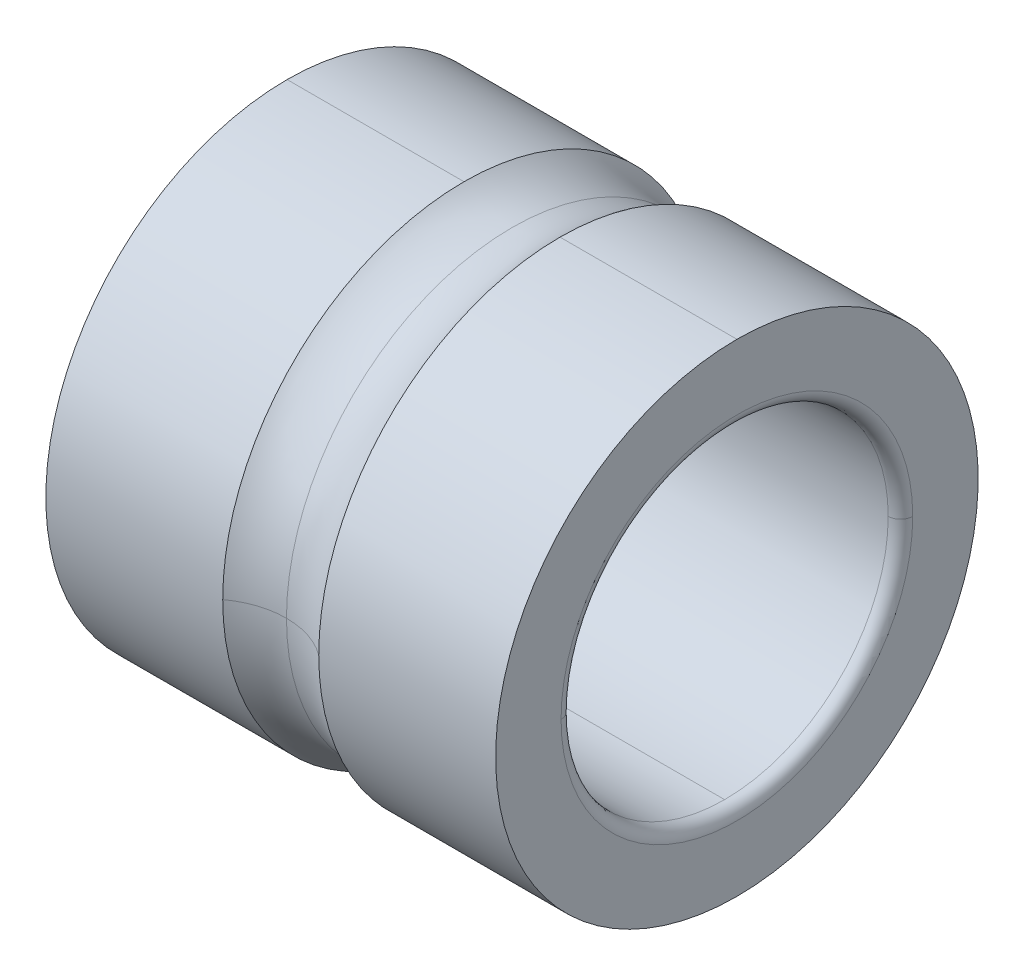
ISO-10303-21;
HEADER;
FILE_DESCRIPTION(('STEP AP214'),'2;1');
FILE_NAME('part.step','',(''),(''),'','','');
FILE_SCHEMA(('AUTOMOTIVE_DESIGN { 1 0 10303 214 1 1 1 1 }'));
ENDSEC;
DATA;
#1=APPLICATION_CONTEXT('core data for automotive mechanical design processes');
#2=APPLICATION_PROTOCOL_DEFINITION('international standard','automotive_design',2000,#1);
#3=PRODUCT_CONTEXT('',#1,'mechanical');
#4=PRODUCT('Part','Part','',(#3));
#5=PRODUCT_RELATED_PRODUCT_CATEGORY('part','',(#4));
#6=PRODUCT_DEFINITION_FORMATION('','',#4);
#7=PRODUCT_DEFINITION_CONTEXT('part definition',#1,'design');
#8=PRODUCT_DEFINITION('design','',#6,#7);
#9=PRODUCT_DEFINITION_SHAPE('','',#8);
#10=(LENGTH_UNIT() NAMED_UNIT(*) SI_UNIT(.MILLI.,.METRE.));
#11=(NAMED_UNIT(*) PLANE_ANGLE_UNIT() SI_UNIT($,.RADIAN.));
#12=(NAMED_UNIT(*) SI_UNIT($,.STERADIAN.) SOLID_ANGLE_UNIT());
#13=UNCERTAINTY_MEASURE_WITH_UNIT(LENGTH_MEASURE(1.E-05),#10,'distance_accuracy_value','');
#14=(GEOMETRIC_REPRESENTATION_CONTEXT(3) GLOBAL_UNCERTAINTY_ASSIGNED_CONTEXT((#13)) GLOBAL_UNIT_ASSIGNED_CONTEXT((#10,
#11,#12)) REPRESENTATION_CONTEXT('',''));
#15=CARTESIAN_POINT('',(0.,0.,0.));
#16=DIRECTION('',(0.,0.,1.));
#17=DIRECTION('',(1.,0.,0.));
#18=AXIS2_PLACEMENT_3D('',#15,#16,#17);
#19=CARTESIAN_POINT('',(8.83699238708862,0.,0.));
#20=DIRECTION('',(1.,0.,0.));
#21=DIRECTION('',(0.,1.,0.));
#22=AXIS2_PLACEMENT_3D('',#19,#20,#21);
#23=CYLINDRICAL_SURFACE('',#22,5.9);
#24=DIRECTION('',(1.,0.,0.));
#25=VECTOR('',#24,1.);
#26=CARTESIAN_POINT('',(8.83699238708862,5.9,0.));
#27=LINE('',#26,#25);
#28=CARTESIAN_POINT('',(6.67398477417725,5.9,0.));
#29=VERTEX_POINT('',#28);
#30=CARTESIAN_POINT('',(11.,5.9,0.));
#31=VERTEX_POINT('',#30);
#32=EDGE_CURVE('E150',#29,#31,#27,.T.);
#33=ORIENTED_EDGE('',*,*,#32,.T.);
#34=CARTESIAN_POINT('',(11.,0.,0.));
#35=DIRECTION('',(1.,0.,0.));
#36=DIRECTION('',(0.,1.,0.));
#37=AXIS2_PLACEMENT_3D('',#34,#35,#36);
#38=CIRCLE('',#37,5.9);
#39=CARTESIAN_POINT('',(11.,-5.9,0.));
#40=VERTEX_POINT('',#39);
#41=EDGE_CURVE('E213',#40,#31,#38,.T.);
#42=ORIENTED_EDGE('',*,*,#41,.F.);
#43=DIRECTION('',(-1.,0.,0.));
#44=VECTOR('',#43,1.);
#45=CARTESIAN_POINT('',(8.83699238708862,-5.9,0.));
#46=LINE('',#45,#44);
#47=CARTESIAN_POINT('',(6.67398477417725,-5.9,0.));
#48=VERTEX_POINT('',#47);
#49=EDGE_CURVE('E156',#40,#48,#46,.T.);
#50=ORIENTED_EDGE('',*,*,#49,.T.);
#51=CARTESIAN_POINT('',(6.67398477417725,0.,0.));
#52=DIRECTION('',(1.,0.,0.));
#53=DIRECTION('',(0.,1.,0.));
#54=AXIS2_PLACEMENT_3D('',#51,#52,#53);
#55=CIRCLE('',#54,5.9);
#56=CARTESIAN_POINT('',(6.67398477417725,0.,-5.9));
#57=VERTEX_POINT('',#56);
#58=EDGE_CURVE('E139',#48,#57,#55,.T.);
#59=ORIENTED_EDGE('',*,*,#58,.T.);
#60=CARTESIAN_POINT('',(6.67398477417725,0.,0.));
#61=DIRECTION('',(1.,0.,0.));
#62=DIRECTION('',(0.,1.,0.));
#63=AXIS2_PLACEMENT_3D('',#60,#61,#62);
#64=CIRCLE('',#63,5.9);
#65=EDGE_CURVE('E145',#57,#29,#64,.T.);
#66=ORIENTED_EDGE('',*,*,#65,.T.);
#67=EDGE_LOOP('',(#33,#42,#50,#59,#66));
#68=FACE_BOUND('',#67,.T.);
#69=ADVANCED_FACE('F16',(#68),#23,.T.);
#70=CARTESIAN_POINT('',(5.5,0.,0.));
#71=DIRECTION('',(1.,0.,0.));
#72=DIRECTION('',(0.,0.,-1.));
#73=AXIS2_PLACEMENT_3D('',#70,#71,#72);
#74=TOROIDAL_SURFACE('',#73,7.5,1.9845);
#75=CARTESIAN_POINT('',(5.5,0.,0.));
#76=DIRECTION('',(-1.,0.,0.));
#77=DIRECTION('',(0.,0.,1.));
#78=AXIS2_PLACEMENT_3D('',#75,#76,#77);
#79=CIRCLE('',#78,5.5155);
#80=CARTESIAN_POINT('',(5.5,0.,5.5155));
#81=VERTEX_POINT('',#80);
#82=CARTESIAN_POINT('',(5.5,0.,-5.5155));
#83=VERTEX_POINT('',#82);
#84=EDGE_CURVE('E132',#81,#83,#79,.T.);
#85=ORIENTED_EDGE('',*,*,#84,.T.);
#86=CARTESIAN_POINT('',(5.5,0.,-7.5));
#87=DIRECTION('',(0.,-1.,0.));
#88=DIRECTION('',(0.,0.,-1.));
#89=AXIS2_PLACEMENT_3D('',#86,#87,#88);
#90=CIRCLE('',#89,1.9845);
#91=CARTESIAN_POINT('',(4.32601522582275,0.,-5.9));
#92=VERTEX_POINT('',#91);
#93=EDGE_CURVE('E126',#83,#92,#90,.T.);
#94=ORIENTED_EDGE('',*,*,#93,.T.);
#95=CARTESIAN_POINT('',(4.32601522582275,0.,0.));
#96=DIRECTION('',(1.,0.,0.));
#97=DIRECTION('',(0.,1.,0.));
#98=AXIS2_PLACEMENT_3D('',#95,#96,#97);
#99=CIRCLE('',#98,5.9);
#100=CARTESIAN_POINT('',(4.32601522582275,5.9,0.));
#101=VERTEX_POINT('',#100);
#102=EDGE_CURVE('E11',#92,#101,#99,.T.);
#103=ORIENTED_EDGE('',*,*,#102,.T.);
#104=CARTESIAN_POINT('',(4.32601522582275,0.,0.));
#105=DIRECTION('',(1.,0.,0.));
#106=DIRECTION('',(0.,1.,0.));
#107=AXIS2_PLACEMENT_3D('',#104,#105,#106);
#108=CIRCLE('',#107,5.9);
#109=CARTESIAN_POINT('',(4.32601522582275,0.,5.9));
#110=VERTEX_POINT('',#109);
#111=EDGE_CURVE('E125',#101,#110,#108,.T.);
#112=ORIENTED_EDGE('',*,*,#111,.T.);
#113=CARTESIAN_POINT('',(5.5,0.,7.5));
#114=DIRECTION('',(0.,-1.,0.));
#115=DIRECTION('',(0.,0.,1.));
#116=AXIS2_PLACEMENT_3D('',#113,#114,#115);
#117=CIRCLE('',#116,1.9845);
#118=EDGE_CURVE('E165',#110,#81,#117,.T.);
#119=ORIENTED_EDGE('',*,*,#118,.T.);
#120=EDGE_LOOP('',(#85,#94,#103,#112,#119));
#121=FACE_BOUND('',#120,.T.);
#122=ADVANCED_FACE('F259',(#121),#74,.F.);
#123=CARTESIAN_POINT('',(2.16300761291138,0.,0.));
#124=DIRECTION('',(1.,0.,0.));
#125=DIRECTION('',(0.,1.,0.));
#126=AXIS2_PLACEMENT_3D('',#123,#124,#125);
#127=CYLINDRICAL_SURFACE('',#126,5.9);
#128=DIRECTION('',(1.,0.,0.));
#129=VECTOR('',#128,1.);
#130=CARTESIAN_POINT('',(2.16300761291138,5.9,0.));
#131=LINE('',#130,#129);
#132=CARTESIAN_POINT('',(0.,5.9,0.));
#133=VERTEX_POINT('',#132);
#134=EDGE_CURVE('E112',#133,#101,#131,.T.);
#135=ORIENTED_EDGE('',*,*,#134,.T.);
#136=ORIENTED_EDGE('',*,*,#102,.F.);
#137=CARTESIAN_POINT('',(4.32601522582275,0.,0.));
#138=DIRECTION('',(1.,0.,0.));
#139=DIRECTION('',(0.,1.,0.));
#140=AXIS2_PLACEMENT_3D('',#137,#138,#139);
#141=CIRCLE('',#140,5.9);
#142=CARTESIAN_POINT('',(4.32601522582275,-5.9,0.));
#143=VERTEX_POINT('',#142);
#144=EDGE_CURVE('E129',#143,#92,#141,.T.);
#145=ORIENTED_EDGE('',*,*,#144,.F.);
#146=DIRECTION('',(-1.,0.,0.));
#147=VECTOR('',#146,1.);
#148=CARTESIAN_POINT('',(2.16300761291138,-5.9,0.));
#149=LINE('',#148,#147);
#150=CARTESIAN_POINT('',(0.,-5.9,0.));
#151=VERTEX_POINT('',#150);
#152=EDGE_CURVE('E114',#143,#151,#149,.T.);
#153=ORIENTED_EDGE('',*,*,#152,.T.);
#154=CARTESIAN_POINT('',(0.,0.,0.));
#155=DIRECTION('',(1.,0.,0.));
#156=DIRECTION('',(0.,1.,0.));
#157=AXIS2_PLACEMENT_3D('',#154,#155,#156);
#158=CIRCLE('',#157,5.9);
#159=EDGE_CURVE('E23',#151,#133,#158,.T.);
#160=ORIENTED_EDGE('',*,*,#159,.T.);
#161=EDGE_LOOP('',(#135,#136,#145,#153,#160));
#162=FACE_BOUND('',#161,.T.);
#163=ADVANCED_FACE('F110',(#162),#127,.T.);
#164=CARTESIAN_POINT('',(0.,5.1,0.));
#165=DIRECTION('',(-1.,0.,0.));
#166=DIRECTION('',(0.,0.,1.));
#167=AXIS2_PLACEMENT_3D('',#164,#165,#166);
#168=PLANE('',#167);
#169=CARTESIAN_POINT('',(0.,0.,0.));
#170=DIRECTION('',(1.,0.,0.));
#171=DIRECTION('',(0.,1.,0.));
#172=AXIS2_PLACEMENT_3D('',#169,#170,#171);
#173=CIRCLE('',#172,4.3);
#174=CARTESIAN_POINT('',(0.,0.,4.3));
#175=VERTEX_POINT('',#174);
#176=CARTESIAN_POINT('',(0.,0.,-4.3));
#177=VERTEX_POINT('',#176);
#178=EDGE_CURVE('E117',#175,#177,#173,.T.);
#179=ORIENTED_EDGE('',*,*,#178,.T.);
#180=CARTESIAN_POINT('',(0.,0.,0.));
#181=DIRECTION('',(1.,0.,0.));
#182=DIRECTION('',(0.,1.,0.));
#183=AXIS2_PLACEMENT_3D('',#180,#181,#182);
#184=CIRCLE('',#183,4.3);
#185=EDGE_CURVE('E187',#177,#175,#184,.T.);
#186=ORIENTED_EDGE('',*,*,#185,.T.);
#187=EDGE_LOOP('',(#179,#186));
#188=FACE_BOUND('',#187,.T.);
#189=CARTESIAN_POINT('',(0.,0.,0.));
#190=DIRECTION('',(1.,0.,0.));
#191=DIRECTION('',(0.,1.,0.));
#192=AXIS2_PLACEMENT_3D('',#189,#190,#191);
#193=CIRCLE('',#192,5.9);
#194=EDGE_CURVE('E118',#133,#151,#193,.T.);
#195=ORIENTED_EDGE('',*,*,#194,.F.);
#196=ORIENTED_EDGE('',*,*,#159,.F.);
#197=EDGE_LOOP('',(#195,#196));
#198=FACE_BOUND('',#197,.T.);
#199=ADVANCED_FACE('F119',(#188,#198),#168,.T.);
#200=CARTESIAN_POINT('',(0.3,0.,0.));
#201=DIRECTION('',(1.,0.,0.));
#202=DIRECTION('',(0.,0.,-1.));
#203=AXIS2_PLACEMENT_3D('',#200,#201,#202);
#204=TOROIDAL_SURFACE('',#203,4.3,0.3);
#205=CARTESIAN_POINT('',(0.3,0.,-4.3));
#206=DIRECTION('',(0.,-1.,0.));
#207=DIRECTION('',(0.,0.,-1.));
#208=AXIS2_PLACEMENT_3D('',#205,#206,#207);
#209=CIRCLE('',#208,0.3);
#210=CARTESIAN_POINT('',(0.3,0.,-4.));
#211=VERTEX_POINT('',#210);
#212=EDGE_CURVE('E175',#211,#177,#209,.T.);
#213=ORIENTED_EDGE('',*,*,#212,.T.);
#214=ORIENTED_EDGE('',*,*,#178,.F.);
#215=CARTESIAN_POINT('',(0.3,0.,4.3));
#216=DIRECTION('',(0.,-1.,0.));
#217=DIRECTION('',(0.,0.,1.));
#218=AXIS2_PLACEMENT_3D('',#215,#216,#217);
#219=CIRCLE('',#218,0.3);
#220=CARTESIAN_POINT('',(0.3,0.,4.));
#221=VERTEX_POINT('',#220);
#222=EDGE_CURVE('E184',#175,#221,#219,.T.);
#223=ORIENTED_EDGE('',*,*,#222,.T.);
#224=CARTESIAN_POINT('',(0.3,0.,0.));
#225=DIRECTION('',(1.,0.,0.));
#226=DIRECTION('',(0.,1.,0.));
#227=AXIS2_PLACEMENT_3D('',#224,#225,#226);
#228=CIRCLE('',#227,4.);
#229=CARTESIAN_POINT('',(0.3,-4.,0.));
#230=VERTEX_POINT('',#229);
#231=EDGE_CURVE('E147',#221,#230,#228,.T.);
#232=ORIENTED_EDGE('',*,*,#231,.T.);
#233=CARTESIAN_POINT('',(0.3,0.,0.));
#234=DIRECTION('',(1.,0.,0.));
#235=DIRECTION('',(0.,1.,0.));
#236=AXIS2_PLACEMENT_3D('',#233,#234,#235);
#237=CIRCLE('',#236,4.);
#238=EDGE_CURVE('E193',#230,#211,#237,.T.);
#239=ORIENTED_EDGE('',*,*,#238,.T.);
#240=EDGE_LOOP('',(#213,#214,#223,#232,#239));
#241=FACE_BOUND('',#240,.T.);
#242=ADVANCED_FACE('F223',(#241),#204,.T.);
#243=CARTESIAN_POINT('',(5.5,0.,0.));
#244=DIRECTION('',(1.,0.,0.));
#245=DIRECTION('',(0.,1.,0.));
#246=AXIS2_PLACEMENT_3D('',#243,#244,#245);
#247=CYLINDRICAL_SURFACE('',#246,4.);
#248=DIRECTION('',(1.,0.,0.));
#249=VECTOR('',#248,1.);
#250=CARTESIAN_POINT('',(5.5,4.,0.));
#251=LINE('',#250,#249);
#252=CARTESIAN_POINT('',(0.3,4.,0.));
#253=VERTEX_POINT('',#252);
#254=CARTESIAN_POINT('',(10.7,4.,0.));
#255=VERTEX_POINT('',#254);
#256=EDGE_CURVE('E190',#253,#255,#251,.T.);
#257=ORIENTED_EDGE('',*,*,#256,.T.);
#258=CARTESIAN_POINT('',(10.7,0.,0.));
#259=DIRECTION('',(1.,0.,0.));
#260=DIRECTION('',(0.,1.,0.));
#261=AXIS2_PLACEMENT_3D('',#258,#259,#260);
#262=CIRCLE('',#261,4.);
#263=CARTESIAN_POINT('',(10.7,0.,4.));
#264=VERTEX_POINT('',#263);
#265=EDGE_CURVE('E211',#255,#264,#262,.T.);
#266=ORIENTED_EDGE('',*,*,#265,.T.);
#267=CARTESIAN_POINT('',(10.7,0.,0.));
#268=DIRECTION('',(1.,0.,0.));
#269=DIRECTION('',(0.,1.,0.));
#270=AXIS2_PLACEMENT_3D('',#267,#268,#269);
#271=CIRCLE('',#270,4.);
#272=CARTESIAN_POINT('',(10.7,-4.,0.));
#273=VERTEX_POINT('',#272);
#274=EDGE_CURVE('E30',#264,#273,#271,.T.);
#275=ORIENTED_EDGE('',*,*,#274,.T.);
#276=DIRECTION('',(-1.,0.,0.));
#277=VECTOR('',#276,1.);
#278=CARTESIAN_POINT('',(5.5,-4.,0.));
#279=LINE('',#278,#277);
#280=EDGE_CURVE('E195',#273,#230,#279,.T.);
#281=ORIENTED_EDGE('',*,*,#280,.T.);
#282=ORIENTED_EDGE('',*,*,#231,.F.);
#283=CARTESIAN_POINT('',(0.3,0.,0.));
#284=DIRECTION('',(1.,0.,0.));
#285=DIRECTION('',(0.,1.,0.));
#286=AXIS2_PLACEMENT_3D('',#283,#284,#285);
#287=CIRCLE('',#286,4.);
#288=EDGE_CURVE('E181',#253,#221,#287,.T.);
#289=ORIENTED_EDGE('',*,*,#288,.F.);
#290=EDGE_LOOP('',(#257,#266,#275,#281,#282,#289));
#291=FACE_BOUND('',#290,.T.);
#292=ADVANCED_FACE('F231',(#291),#247,.F.);
#293=CARTESIAN_POINT('',(10.7,0.,0.));
#294=DIRECTION('',(1.,0.,0.));
#295=DIRECTION('',(0.,0.,-1.));
#296=AXIS2_PLACEMENT_3D('',#293,#294,#295);
#297=TOROIDAL_SURFACE('',#296,4.3,0.3);
#298=CARTESIAN_POINT('',(10.7,0.,-4.3));
#299=DIRECTION('',(0.,-1.,0.));
#300=DIRECTION('',(0.,0.,-1.));
#301=AXIS2_PLACEMENT_3D('',#298,#299,#300);
#302=CIRCLE('',#301,0.3);
#303=CARTESIAN_POINT('',(11.,0.,-4.3));
#304=VERTEX_POINT('',#303);
#305=CARTESIAN_POINT('',(10.7,0.,-4.));
#306=VERTEX_POINT('',#305);
#307=EDGE_CURVE('E204',#304,#306,#302,.T.);
#308=ORIENTED_EDGE('',*,*,#307,.T.);
#309=CARTESIAN_POINT('',(10.7,0.,0.));
#310=DIRECTION('',(1.,0.,0.));
#311=DIRECTION('',(0.,1.,0.));
#312=AXIS2_PLACEMENT_3D('',#309,#310,#311);
#313=CIRCLE('',#312,4.);
#314=EDGE_CURVE('E198',#273,#306,#313,.T.);
#315=ORIENTED_EDGE('',*,*,#314,.F.);
#316=ORIENTED_EDGE('',*,*,#274,.F.);
#317=CARTESIAN_POINT('',(10.7,0.,4.3));
#318=DIRECTION('',(0.,-1.,0.));
#319=DIRECTION('',(0.,0.,1.));
#320=AXIS2_PLACEMENT_3D('',#317,#318,#319);
#321=CIRCLE('',#320,0.3);
#322=CARTESIAN_POINT('',(11.,0.,4.3));
#323=VERTEX_POINT('',#322);
#324=EDGE_CURVE('E209',#264,#323,#321,.T.);
#325=ORIENTED_EDGE('',*,*,#324,.T.);
#326=CARTESIAN_POINT('',(11.,0.,0.));
#327=DIRECTION('',(1.,0.,0.));
#328=DIRECTION('',(0.,1.,0.));
#329=AXIS2_PLACEMENT_3D('',#326,#327,#328);
#330=CIRCLE('',#329,4.3);
#331=EDGE_CURVE('E37',#323,#304,#330,.T.);
#332=ORIENTED_EDGE('',*,*,#331,.T.);
#333=EDGE_LOOP('',(#308,#315,#316,#325,#332));
#334=FACE_BOUND('',#333,.T.);
#335=ADVANCED_FACE('F233',(#334),#297,.T.);
#336=CARTESIAN_POINT('',(11.,5.1,0.));
#337=DIRECTION('',(1.,0.,0.));
#338=DIRECTION('',(0.,1.,0.));
#339=AXIS2_PLACEMENT_3D('',#336,#337,#338);
#340=PLANE('',#339);
#341=CARTESIAN_POINT('',(11.,0.,0.));
#342=DIRECTION('',(1.,0.,0.));
#343=DIRECTION('',(0.,1.,0.));
#344=AXIS2_PLACEMENT_3D('',#341,#342,#343);
#345=CIRCLE('',#344,4.3);
#346=EDGE_CURVE('E206',#304,#323,#345,.T.);
#347=ORIENTED_EDGE('',*,*,#346,.F.);
#348=ORIENTED_EDGE('',*,*,#331,.F.);
#349=EDGE_LOOP('',(#347,#348));
#350=FACE_BOUND('',#349,.T.);
#351=CARTESIAN_POINT('',(11.,0.,0.));
#352=DIRECTION('',(1.,0.,0.));
#353=DIRECTION('',(0.,1.,0.));
#354=AXIS2_PLACEMENT_3D('',#351,#352,#353);
#355=CIRCLE('',#354,5.9);
#356=EDGE_CURVE('E158',#31,#40,#355,.T.);
#357=ORIENTED_EDGE('',*,*,#356,.T.);
#358=ORIENTED_EDGE('',*,*,#41,.T.);
#359=EDGE_LOOP('',(#357,#358));
#360=FACE_BOUND('',#359,.T.);
#361=ADVANCED_FACE('F238',(#350,#360),#340,.T.);
#362=CARTESIAN_POINT('',(10.7,0.,0.));
#363=DIRECTION('',(1.,0.,0.));
#364=DIRECTION('',(0.,0.,-1.));
#365=AXIS2_PLACEMENT_3D('',#362,#363,#364);
#366=TOROIDAL_SURFACE('',#365,4.3,0.3);
#367=ORIENTED_EDGE('',*,*,#307,.F.);
#368=ORIENTED_EDGE('',*,*,#346,.T.);
#369=ORIENTED_EDGE('',*,*,#324,.F.);
#370=ORIENTED_EDGE('',*,*,#265,.F.);
#371=CARTESIAN_POINT('',(10.7,0.,0.));
#372=DIRECTION('',(1.,0.,0.));
#373=DIRECTION('',(0.,1.,0.));
#374=AXIS2_PLACEMENT_3D('',#371,#372,#373);
#375=CIRCLE('',#374,4.);
#376=EDGE_CURVE('E201',#306,#255,#375,.T.);
#377=ORIENTED_EDGE('',*,*,#376,.F.);
#378=EDGE_LOOP('',(#367,#368,#369,#370,#377));
#379=FACE_BOUND('',#378,.T.);
#380=ADVANCED_FACE('F236',(#379),#366,.T.);
#381=CARTESIAN_POINT('',(5.5,0.,0.));
#382=DIRECTION('',(1.,0.,0.));
#383=DIRECTION('',(0.,1.,0.));
#384=AXIS2_PLACEMENT_3D('',#381,#382,#383);
#385=CYLINDRICAL_SURFACE('',#384,4.);
#386=ORIENTED_EDGE('',*,*,#256,.F.);
#387=CARTESIAN_POINT('',(0.3,0.,0.));
#388=DIRECTION('',(1.,0.,0.));
#389=DIRECTION('',(0.,1.,0.));
#390=AXIS2_PLACEMENT_3D('',#387,#388,#389);
#391=CIRCLE('',#390,4.);
#392=EDGE_CURVE('E178',#211,#253,#391,.T.);
#393=ORIENTED_EDGE('',*,*,#392,.F.);
#394=ORIENTED_EDGE('',*,*,#238,.F.);
#395=ORIENTED_EDGE('',*,*,#280,.F.);
#396=ORIENTED_EDGE('',*,*,#314,.T.);
#397=ORIENTED_EDGE('',*,*,#376,.T.);
#398=EDGE_LOOP('',(#386,#393,#394,#395,#396,#397));
#399=FACE_BOUND('',#398,.T.);
#400=ADVANCED_FACE('F228',(#399),#385,.F.);
#401=CARTESIAN_POINT('',(0.3,0.,0.));
#402=DIRECTION('',(1.,0.,0.));
#403=DIRECTION('',(0.,0.,-1.));
#404=AXIS2_PLACEMENT_3D('',#401,#402,#403);
#405=TOROIDAL_SURFACE('',#404,4.3,0.3);
#406=ORIENTED_EDGE('',*,*,#212,.F.);
#407=ORIENTED_EDGE('',*,*,#392,.T.);
#408=ORIENTED_EDGE('',*,*,#288,.T.);
#409=ORIENTED_EDGE('',*,*,#222,.F.);
#410=ORIENTED_EDGE('',*,*,#185,.F.);
#411=EDGE_LOOP('',(#406,#407,#408,#409,#410));
#412=FACE_BOUND('',#411,.T.);
#413=ADVANCED_FACE('F222',(#412),#405,.T.);
#414=CARTESIAN_POINT('',(2.16300761291138,0.,0.));
#415=DIRECTION('',(1.,0.,0.));
#416=DIRECTION('',(0.,1.,0.));
#417=AXIS2_PLACEMENT_3D('',#414,#415,#416);
#418=CYLINDRICAL_SURFACE('',#417,5.9);
#419=ORIENTED_EDGE('',*,*,#134,.F.);
#420=ORIENTED_EDGE('',*,*,#194,.T.);
#421=ORIENTED_EDGE('',*,*,#152,.F.);
#422=CARTESIAN_POINT('',(4.32601522582275,0.,0.));
#423=DIRECTION('',(1.,0.,0.));
#424=DIRECTION('',(0.,1.,0.));
#425=AXIS2_PLACEMENT_3D('',#422,#423,#424);
#426=CIRCLE('',#425,5.9);
#427=EDGE_CURVE('E167',#110,#143,#426,.T.);
#428=ORIENTED_EDGE('',*,*,#427,.F.);
#429=ORIENTED_EDGE('',*,*,#111,.F.);
#430=EDGE_LOOP('',(#419,#420,#421,#428,#429));
#431=FACE_BOUND('',#430,.T.);
#432=ADVANCED_FACE('F123',(#431),#418,.T.);
#433=CARTESIAN_POINT('',(5.5,0.,0.));
#434=DIRECTION('',(1.,0.,0.));
#435=DIRECTION('',(0.,0.,-1.));
#436=AXIS2_PLACEMENT_3D('',#433,#434,#435);
#437=TOROIDAL_SURFACE('',#436,7.5,1.9845);
#438=CARTESIAN_POINT('',(5.5,0.,0.));
#439=DIRECTION('',(-1.,0.,0.));
#440=DIRECTION('',(0.,0.,1.));
#441=AXIS2_PLACEMENT_3D('',#438,#439,#440);
#442=CIRCLE('',#441,5.5155);
#443=EDGE_CURVE('E142',#83,#81,#442,.T.);
#444=ORIENTED_EDGE('',*,*,#443,.T.);
#445=ORIENTED_EDGE('',*,*,#118,.F.);
#446=ORIENTED_EDGE('',*,*,#427,.T.);
#447=ORIENTED_EDGE('',*,*,#144,.T.);
#448=ORIENTED_EDGE('',*,*,#93,.F.);
#449=EDGE_LOOP('',(#444,#445,#446,#447,#448));
#450=FACE_BOUND('',#449,.T.);
#451=ADVANCED_FACE('F262',(#450),#437,.F.);
#452=CARTESIAN_POINT('',(8.83699238708862,0.,0.));
#453=DIRECTION('',(1.,0.,0.));
#454=DIRECTION('',(0.,1.,0.));
#455=AXIS2_PLACEMENT_3D('',#452,#453,#454);
#456=CYLINDRICAL_SURFACE('',#455,5.9);
#457=ORIENTED_EDGE('',*,*,#32,.F.);
#458=CARTESIAN_POINT('',(6.67398477417725,0.,0.));
#459=DIRECTION('',(1.,0.,0.));
#460=DIRECTION('',(0.,1.,0.));
#461=AXIS2_PLACEMENT_3D('',#458,#459,#460);
#462=CIRCLE('',#461,5.9);
#463=CARTESIAN_POINT('',(6.67398477417725,0.,5.9));
#464=VERTEX_POINT('',#463);
#465=EDGE_CURVE('E138',#29,#464,#462,.T.);
#466=ORIENTED_EDGE('',*,*,#465,.T.);
#467=CARTESIAN_POINT('',(6.67398477417725,0.,0.));
#468=DIRECTION('',(1.,0.,0.));
#469=DIRECTION('',(0.,1.,0.));
#470=AXIS2_PLACEMENT_3D('',#467,#468,#469);
#471=CIRCLE('',#470,5.9);
#472=EDGE_CURVE('E141',#464,#48,#471,.T.);
#473=ORIENTED_EDGE('',*,*,#472,.T.);
#474=ORIENTED_EDGE('',*,*,#49,.F.);
#475=ORIENTED_EDGE('',*,*,#356,.F.);
#476=EDGE_LOOP('',(#457,#466,#473,#474,#475));
#477=FACE_BOUND('',#476,.T.);
#478=ADVANCED_FACE('F245',(#477),#456,.T.);
#479=CARTESIAN_POINT('',(5.5,0.,0.));
#480=DIRECTION('',(1.,0.,0.));
#481=DIRECTION('',(0.,0.,-1.));
#482=AXIS2_PLACEMENT_3D('',#479,#480,#481);
#483=TOROIDAL_SURFACE('',#482,7.5,1.9845);
#484=ORIENTED_EDGE('',*,*,#443,.F.);
#485=CARTESIAN_POINT('',(5.5,0.,-7.5));
#486=DIRECTION('',(0.,-1.,0.));
#487=DIRECTION('',(0.,0.,-1.));
#488=AXIS2_PLACEMENT_3D('',#485,#486,#487);
#489=CIRCLE('',#488,1.9845);
#490=EDGE_CURVE('E153',#57,#83,#489,.T.);
#491=ORIENTED_EDGE('',*,*,#490,.F.);
#492=ORIENTED_EDGE('',*,*,#58,.F.);
#493=ORIENTED_EDGE('',*,*,#472,.F.);
#494=CARTESIAN_POINT('',(5.5,0.,7.5));
#495=DIRECTION('',(0.,-1.,0.));
#496=DIRECTION('',(0.,0.,1.));
#497=AXIS2_PLACEMENT_3D('',#494,#495,#496);
#498=CIRCLE('',#497,1.9845);
#499=EDGE_CURVE('E135',#81,#464,#498,.T.);
#500=ORIENTED_EDGE('',*,*,#499,.F.);
#501=EDGE_LOOP('',(#484,#491,#492,#493,#500));
#502=FACE_BOUND('',#501,.T.);
#503=ADVANCED_FACE('F257',(#502),#483,.F.);
#504=CARTESIAN_POINT('',(5.5,0.,0.));
#505=DIRECTION('',(1.,0.,0.));
#506=DIRECTION('',(0.,0.,-1.));
#507=AXIS2_PLACEMENT_3D('',#504,#505,#506);
#508=TOROIDAL_SURFACE('',#507,7.5,1.9845);
#509=ORIENTED_EDGE('',*,*,#84,.F.);
#510=ORIENTED_EDGE('',*,*,#499,.T.);
#511=ORIENTED_EDGE('',*,*,#465,.F.);
#512=ORIENTED_EDGE('',*,*,#65,.F.);
#513=ORIENTED_EDGE('',*,*,#490,.T.);
#514=EDGE_LOOP('',(#509,#510,#511,#512,#513));
#515=FACE_BOUND('',#514,.T.);
#516=ADVANCED_FACE('F254',(#515),#508,.F.);
#517=CLOSED_SHELL('',(#69,#122,#163,#199,#242,#292,#335,#361,#380,#400,#413,#432,#451,#478,#503,#516));
#518=MANIFOLD_SOLID_BREP('B1',#517);
#519=ADVANCED_BREP_SHAPE_REPRESENTATION('',(#18,#518),#14);
#520=SHAPE_DEFINITION_REPRESENTATION(#9,#519);
ENDSEC;
END-ISO-10303-21;
